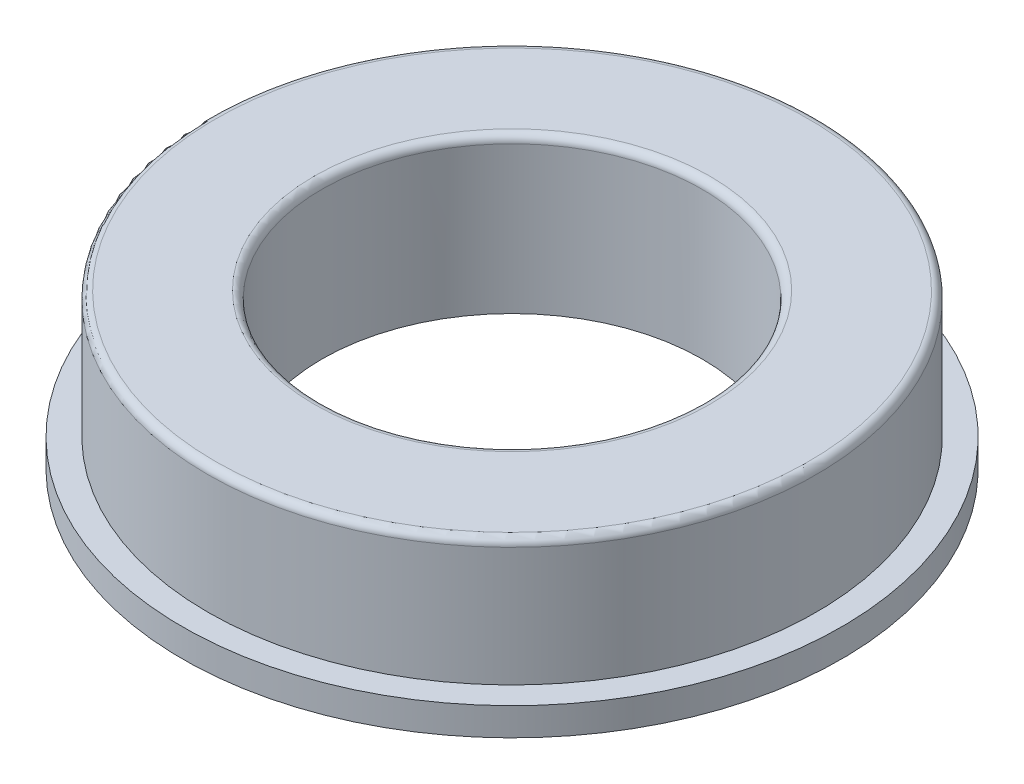
ISO-10303-21;
HEADER;
FILE_DESCRIPTION(('STEP AP214'),'2;1');
FILE_NAME('part.step','',(''),(''),'','','');
FILE_SCHEMA(('AUTOMOTIVE_DESIGN { 1 0 10303 214 1 1 1 1 }'));
ENDSEC;
DATA;
#1=APPLICATION_CONTEXT('core data for automotive mechanical design processes');
#2=APPLICATION_PROTOCOL_DEFINITION('international standard','automotive_design',2000,#1);
#3=PRODUCT_CONTEXT('',#1,'mechanical');
#4=PRODUCT('Part','Part','',(#3));
#5=PRODUCT_RELATED_PRODUCT_CATEGORY('part','',(#4));
#6=PRODUCT_DEFINITION_FORMATION('','',#4);
#7=PRODUCT_DEFINITION_CONTEXT('part definition',#1,'design');
#8=PRODUCT_DEFINITION('design','',#6,#7);
#9=PRODUCT_DEFINITION_SHAPE('','',#8);
#10=(LENGTH_UNIT() NAMED_UNIT(*) SI_UNIT(.MILLI.,.METRE.));
#11=(NAMED_UNIT(*) PLANE_ANGLE_UNIT() SI_UNIT($,.RADIAN.));
#12=(NAMED_UNIT(*) SI_UNIT($,.STERADIAN.) SOLID_ANGLE_UNIT());
#13=UNCERTAINTY_MEASURE_WITH_UNIT(LENGTH_MEASURE(1.E-05),#10,'distance_accuracy_value','');
#14=(GEOMETRIC_REPRESENTATION_CONTEXT(3) GLOBAL_UNCERTAINTY_ASSIGNED_CONTEXT((#13)) GLOBAL_UNIT_ASSIGNED_CONTEXT((#10,
#11,#12)) REPRESENTATION_CONTEXT('',''));
#15=CARTESIAN_POINT('',(0.,0.,0.));
#16=DIRECTION('',(0.,0.,1.));
#17=DIRECTION('',(1.,0.,0.));
#18=AXIS2_PLACEMENT_3D('',#15,#16,#17);
#19=CARTESIAN_POINT('',(0.,-0.00125000240076445,0.));
#20=DIRECTION('',(0.,1.,0.));
#21=DIRECTION('',(0.,0.,1.));
#22=AXIS2_PLACEMENT_3D('',#19,#20,#21);
#23=CYLINDRICAL_SURFACE('',#22,7.5);
#24=CARTESIAN_POINT('',(0.,4.7,0.));
#25=DIRECTION('',(0.,1.,0.));
#26=DIRECTION('',(0.,0.,1.));
#27=AXIS2_PLACEMENT_3D('',#24,#25,#26);
#28=CIRCLE('',#27,7.5);
#29=CARTESIAN_POINT('',(0.,4.7,7.5));
#30=VERTEX_POINT('',#29);
#31=EDGE_CURVE('E12',#30,#30,#28,.T.);
#32=ORIENTED_EDGE('',*,*,#31,.T.);
#33=EDGE_LOOP('',(#32));
#34=FACE_BOUND('',#33,.T.);
#35=CARTESIAN_POINT('',(0.,-1.1,0.));
#36=DIRECTION('',(0.,-1.,0.));
#37=DIRECTION('',(0.,0.,-1.));
#38=AXIS2_PLACEMENT_3D('',#35,#36,#37);
#39=CIRCLE('',#38,7.5);
#40=CARTESIAN_POINT('',(0.,-1.1,-7.5));
#41=VERTEX_POINT('',#40);
#42=EDGE_CURVE('E70',#41,#41,#39,.F.);
#43=ORIENTED_EDGE('',*,*,#42,.F.);
#44=EDGE_LOOP('',(#43));
#45=FACE_BOUND('',#44,.T.);
#46=ADVANCED_FACE('F44',(#34,#45),#23,.F.);
#47=CARTESIAN_POINT('',(0.,4.7,0.));
#48=DIRECTION('',(0.,1.,0.));
#49=DIRECTION('',(0.,0.,1.));
#50=AXIS2_PLACEMENT_3D('',#47,#48,#49);
#51=TOROIDAL_SURFACE('',#50,7.8,0.3);
#52=CARTESIAN_POINT('',(0.,5.,0.));
#53=DIRECTION('',(0.,1.,0.));
#54=DIRECTION('',(0.,0.,1.));
#55=AXIS2_PLACEMENT_3D('',#52,#53,#54);
#56=CIRCLE('',#55,7.8);
#57=CARTESIAN_POINT('',(0.,5.,7.8));
#58=VERTEX_POINT('',#57);
#59=EDGE_CURVE('E50',#58,#58,#56,.T.);
#60=ORIENTED_EDGE('',*,*,#59,.T.);
#61=EDGE_LOOP('',(#60));
#62=FACE_BOUND('',#61,.T.);
#63=ORIENTED_EDGE('',*,*,#31,.F.);
#64=EDGE_LOOP('',(#63));
#65=FACE_BOUND('',#64,.T.);
#66=ADVANCED_FACE('F80',(#62,#65),#51,.T.);
#67=CARTESIAN_POINT('',(7.8,5.,0.));
#68=DIRECTION('',(0.,1.,0.));
#69=DIRECTION('',(0.,0.,1.));
#70=AXIS2_PLACEMENT_3D('',#67,#68,#69);
#71=PLANE('',#70);
#72=CARTESIAN_POINT('',(0.,5.,0.));
#73=DIRECTION('',(0.,1.,0.));
#74=DIRECTION('',(0.,0.,1.));
#75=AXIS2_PLACEMENT_3D('',#72,#73,#74);
#76=CIRCLE('',#75,11.7);
#77=CARTESIAN_POINT('',(0.,5.,11.7));
#78=VERTEX_POINT('',#77);
#79=EDGE_CURVE('E54',#78,#78,#76,.T.);
#80=ORIENTED_EDGE('',*,*,#79,.T.);
#81=EDGE_LOOP('',(#80));
#82=FACE_BOUND('',#81,.T.);
#83=ORIENTED_EDGE('',*,*,#59,.F.);
#84=EDGE_LOOP('',(#83));
#85=FACE_BOUND('',#84,.T.);
#86=ADVANCED_FACE('F84',(#82,#85),#71,.T.);
#87=CARTESIAN_POINT('',(0.,4.7,0.));
#88=DIRECTION('',(0.,1.,0.));
#89=DIRECTION('',(0.,0.,1.));
#90=AXIS2_PLACEMENT_3D('',#87,#88,#89);
#91=TOROIDAL_SURFACE('',#90,11.7,0.3);
#92=CARTESIAN_POINT('',(0.,4.7,0.));
#93=DIRECTION('',(0.,1.,0.));
#94=DIRECTION('',(0.,0.,1.));
#95=AXIS2_PLACEMENT_3D('',#92,#93,#94);
#96=CIRCLE('',#95,12.);
#97=CARTESIAN_POINT('',(0.,4.7,12.));
#98=VERTEX_POINT('',#97);
#99=EDGE_CURVE('E58',#98,#98,#96,.T.);
#100=ORIENTED_EDGE('',*,*,#99,.T.);
#101=EDGE_LOOP('',(#100));
#102=FACE_BOUND('',#101,.T.);
#103=ORIENTED_EDGE('',*,*,#79,.F.);
#104=EDGE_LOOP('',(#103));
#105=FACE_BOUND('',#104,.T.);
#106=ADVANCED_FACE('F88',(#102,#105),#91,.T.);
#107=CARTESIAN_POINT('',(0.,-0.00125000240076445,0.));
#108=DIRECTION('',(0.,1.,0.));
#109=DIRECTION('',(0.,0.,1.));
#110=AXIS2_PLACEMENT_3D('',#107,#108,#109);
#111=CYLINDRICAL_SURFACE('',#110,12.);
#112=CARTESIAN_POINT('',(0.,0.,0.));
#113=DIRECTION('',(0.,1.,0.));
#114=DIRECTION('',(0.,0.,1.));
#115=AXIS2_PLACEMENT_3D('',#112,#113,#114);
#116=CIRCLE('',#115,12.);
#117=CARTESIAN_POINT('',(0.,0.,12.));
#118=VERTEX_POINT('',#117);
#119=EDGE_CURVE('E63',#118,#118,#116,.T.);
#120=ORIENTED_EDGE('',*,*,#119,.T.);
#121=EDGE_LOOP('',(#120));
#122=FACE_BOUND('',#121,.T.);
#123=ORIENTED_EDGE('',*,*,#99,.F.);
#124=EDGE_LOOP('',(#123));
#125=FACE_BOUND('',#124,.T.);
#126=ADVANCED_FACE('F95',(#122,#125),#111,.T.);
#127=CARTESIAN_POINT('',(0.,0.,0.));
#128=DIRECTION('',(0.,-1.,0.));
#129=DIRECTION('',(0.,0.,-1.));
#130=AXIS2_PLACEMENT_3D('',#127,#128,#129);
#131=PLANE('',#130);
#132=ORIENTED_EDGE('',*,*,#119,.F.);
#133=EDGE_LOOP('',(#132));
#134=FACE_BOUND('',#133,.T.);
#135=CARTESIAN_POINT('',(0.,0.,0.));
#136=DIRECTION('',(0.,-1.,0.));
#137=DIRECTION('',(0.,0.,-1.));
#138=AXIS2_PLACEMENT_3D('',#135,#136,#137);
#139=CIRCLE('',#138,13.);
#140=CARTESIAN_POINT('',(0.,0.,-13.));
#141=VERTEX_POINT('',#140);
#142=EDGE_CURVE('E67',#141,#141,#139,.T.);
#143=ORIENTED_EDGE('',*,*,#142,.F.);
#144=EDGE_LOOP('',(#143));
#145=FACE_BOUND('',#144,.T.);
#146=ADVANCED_FACE('F99',(#134,#145),#131,.F.);
#147=CARTESIAN_POINT('',(0.,-1.1,0.));
#148=DIRECTION('',(0.,-1.,0.));
#149=DIRECTION('',(0.,0.,-1.));
#150=AXIS2_PLACEMENT_3D('',#147,#148,#149);
#151=PLANE('',#150);
#152=ORIENTED_EDGE('',*,*,#42,.T.);
#153=EDGE_LOOP('',(#152));
#154=FACE_BOUND('',#153,.T.);
#155=CARTESIAN_POINT('',(0.,-1.1,0.));
#156=DIRECTION('',(0.,-1.,0.));
#157=DIRECTION('',(0.,0.,-1.));
#158=AXIS2_PLACEMENT_3D('',#155,#156,#157);
#159=CIRCLE('',#158,13.);
#160=CARTESIAN_POINT('',(0.,-1.1,-13.));
#161=VERTEX_POINT('',#160);
#162=EDGE_CURVE('E66',#161,#161,#159,.T.);
#163=ORIENTED_EDGE('',*,*,#162,.T.);
#164=EDGE_LOOP('',(#163));
#165=FACE_BOUND('',#164,.T.);
#166=ADVANCED_FACE('F76',(#154,#165),#151,.T.);
#167=CARTESIAN_POINT('',(0.,-1.1,0.));
#168=DIRECTION('',(0.,1.,0.));
#169=DIRECTION('',(0.,0.,1.));
#170=AXIS2_PLACEMENT_3D('',#167,#168,#169);
#171=CYLINDRICAL_SURFACE('',#170,13.);
#172=ORIENTED_EDGE('',*,*,#162,.F.);
#173=EDGE_LOOP('',(#172));
#174=FACE_BOUND('',#173,.T.);
#175=ORIENTED_EDGE('',*,*,#142,.T.);
#176=EDGE_LOOP('',(#175));
#177=FACE_BOUND('',#176,.T.);
#178=ADVANCED_FACE('F101',(#174,#177),#171,.T.);
#179=CLOSED_SHELL('',(#46,#66,#86,#106,#126,#146,#166,#178));
#180=MANIFOLD_SOLID_BREP('B2',#179);
#181=ADVANCED_BREP_SHAPE_REPRESENTATION('',(#18,#180),#14);
#182=SHAPE_DEFINITION_REPRESENTATION(#9,#181);
ENDSEC;
END-ISO-10303-21;
